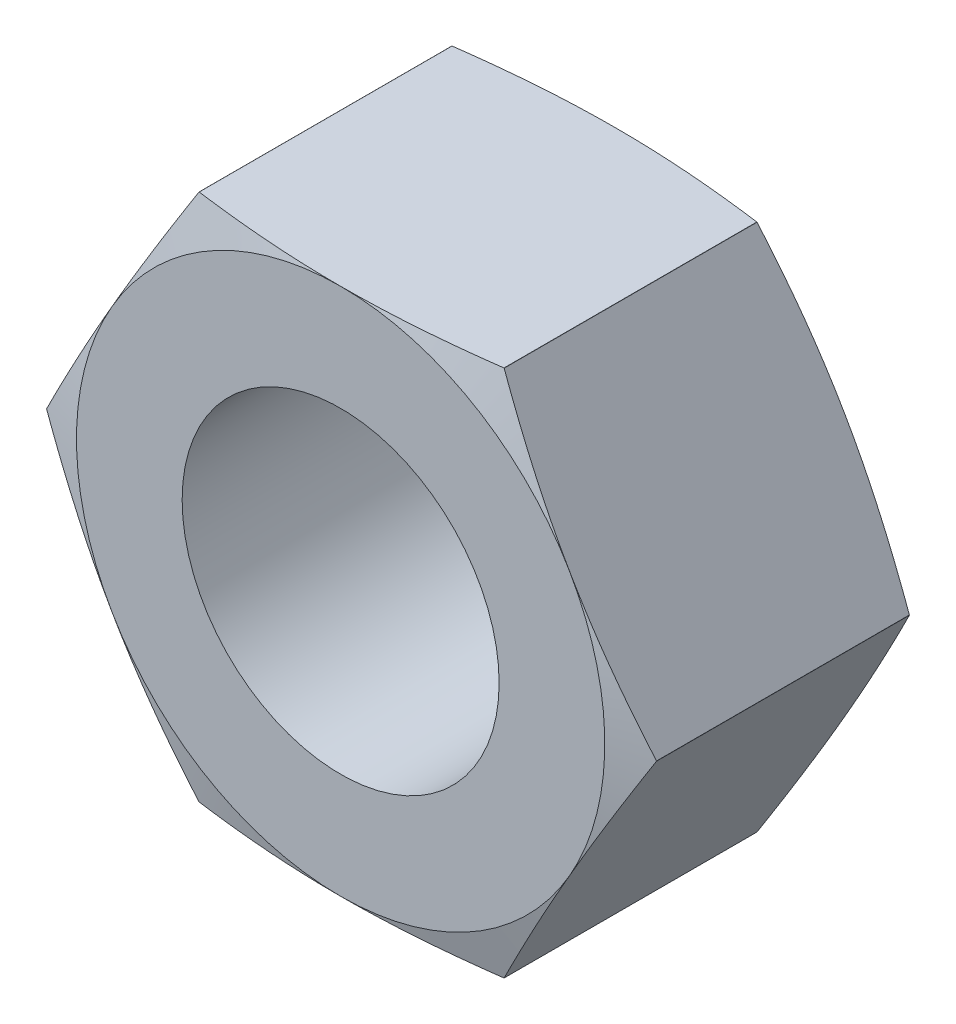
ISO-10303-21;
HEADER;
FILE_DESCRIPTION(('STEP AP214'),'2;1');
FILE_NAME('part.step','',(''),(''),'','','');
FILE_SCHEMA(('AUTOMOTIVE_DESIGN { 1 0 10303 214 1 1 1 1 }'));
ENDSEC;
DATA;
#1=APPLICATION_CONTEXT('core data for automotive mechanical design processes');
#2=APPLICATION_PROTOCOL_DEFINITION('international standard','automotive_design',2000,#1);
#3=PRODUCT_CONTEXT('',#1,'mechanical');
#4=PRODUCT('Part','Part','',(#3));
#5=PRODUCT_RELATED_PRODUCT_CATEGORY('part','',(#4));
#6=PRODUCT_DEFINITION_FORMATION('','',#4);
#7=PRODUCT_DEFINITION_CONTEXT('part definition',#1,'design');
#8=PRODUCT_DEFINITION('design','',#6,#7);
#9=PRODUCT_DEFINITION_SHAPE('','',#8);
#10=(LENGTH_UNIT() NAMED_UNIT(*) SI_UNIT(.MILLI.,.METRE.));
#11=(NAMED_UNIT(*) PLANE_ANGLE_UNIT() SI_UNIT($,.RADIAN.));
#12=(NAMED_UNIT(*) SI_UNIT($,.STERADIAN.) SOLID_ANGLE_UNIT());
#13=UNCERTAINTY_MEASURE_WITH_UNIT(LENGTH_MEASURE(1.E-05),#10,'distance_accuracy_value','');
#14=(GEOMETRIC_REPRESENTATION_CONTEXT(3) GLOBAL_UNCERTAINTY_ASSIGNED_CONTEXT((#13)) GLOBAL_UNIT_ASSIGNED_CONTEXT((#10,
#11,#12)) REPRESENTATION_CONTEXT('',''));
#15=CARTESIAN_POINT('',(0.,0.,0.));
#16=DIRECTION('',(0.,0.,1.));
#17=DIRECTION('',(1.,0.,0.));
#18=AXIS2_PLACEMENT_3D('',#15,#16,#17);
#19=CARTESIAN_POINT('',(0.,0.,-266.4));
#20=DIRECTION('',(0.,0.,-1.));
#21=DIRECTION('',(1.,0.,0.));
#22=AXIS2_PLACEMENT_3D('',#19,#20,#21);
#23=CONICAL_SURFACE('',#22,5.,1.3086733436);
#24=CARTESIAN_POINT('',(5.77250243201678,0.00173250093295696,-266.607259421658));
#25=CARTESIAN_POINT('',(4.99959793859298,1.3404423529406,-266.400000005441));
#26=CARTESIAN_POINT('',(4.33012705684315,2.49999993431865,-266.399999999992));
#27=(BOUNDED_CURVE() B_SPLINE_CURVE(2,(#24,#25,#26),.UNSPECIFIED.,.F.,
.F.) B_SPLINE_CURVE_WITH_KNOTS((3,3),(0.,1.),
.UNSPECIFIED.) CURVE() GEOMETRIC_REPRESENTATION_ITEM() RATIONAL_B_SPLINE_CURVE((1.,
1.03790667442982,1.)) REPRESENTATION_ITEM(''));
#28=CARTESIAN_POINT('',(5.772502431908,0.001732501119538,-266.6072594216));
#29=VERTEX_POINT('',#28);
#30=CARTESIAN_POINT('',(4.330127056858,2.499999934293,-266.4));
#31=VERTEX_POINT('',#30);
#32=EDGE_CURVE('E329',#29,#31,#27,.T.);
#33=ORIENTED_EDGE('',*,*,#32,.T.);
#34=CARTESIAN_POINT('',(0.,0.,-266.4));
#35=DIRECTION('',(0.,0.,-1.));
#36=DIRECTION('',(0.866025411371549,0.49999998685874,0.));
#37=AXIS2_PLACEMENT_3D('',#34,#35,#36);
#38=CIRCLE('',#37,5.);
#39=CARTESIAN_POINT('',(4.330127006451,-2.500000021602,-266.4));
#40=VERTEX_POINT('',#39);
#41=EDGE_CURVE('E532',#31,#40,#38,.T.);
#42=ORIENTED_EDGE('',*,*,#41,.T.);
#43=CARTESIAN_POINT('',(4.33012700646513,-2.50000002157593,-266.399999999992));
#44=CARTESIAN_POINT('',(4.99959791153964,-1.34044239979835,-266.399999998202));
#45=CARTESIAN_POINT('',(5.77250243187274,-0.00173250118245028,-266.60725942162));
#46=(BOUNDED_CURVE() B_SPLINE_CURVE(2,(#43,#44,#45),.UNSPECIFIED.,.F.,
.F.) B_SPLINE_CURVE_WITH_KNOTS((3,3),(0.,1.),
.UNSPECIFIED.) CURVE() GEOMETRIC_REPRESENTATION_ITEM() RATIONAL_B_SPLINE_CURVE((1.,
1.03790667722426,1.)) REPRESENTATION_ITEM(''));
#47=CARTESIAN_POINT('',(5.772502431908,-0.001732501119656,-266.6072594216));
#48=VERTEX_POINT('',#47);
#49=EDGE_CURVE('E253',#40,#48,#46,.T.);
#50=ORIENTED_EDGE('',*,*,#49,.T.);
#51=CARTESIAN_POINT('',(0.,0.,-266.6072594216));
#52=DIRECTION('',(0.,0.,-1.));
#53=DIRECTION('',(0.999999954960996,0.000300129980368399,0.));
#54=AXIS2_PLACEMENT_3D('',#51,#52,#53);
#55=CIRCLE('',#54,5.772502691896);
#56=EDGE_CURVE('E305',#29,#48,#55,.T.);
#57=ORIENTED_EDGE('',*,*,#56,.F.);
#58=EDGE_LOOP('',(#33,#42,#50,#57));
#59=FACE_BOUND('',#58,.T.);
#60=ADVANCED_FACE('F16',(#59),#23,.T.);
#61=CARTESIAN_POINT('',(0.,0.,-266.4));
#62=DIRECTION('',(0.,0.,-1.));
#63=DIRECTION('',(1.,0.,0.));
#64=AXIS2_PLACEMENT_3D('',#61,#62,#63);
#65=CONICAL_SURFACE('',#64,5.,1.3086733436);
#66=CARTESIAN_POINT('',(-2.99468702875652E-08,-5.,-266.399999999992));
#67=CARTESIAN_POINT('',(1.33894178253821,-5.00000000000001,-266.399999997841));
#68=CARTESIAN_POINT('',(2.88475082590115,-5.,-266.60725942162));
#69=(BOUNDED_CURVE() B_SPLINE_CURVE(2,(#66,#67,#68),.UNSPECIFIED.,.F.,
.F.) B_SPLINE_CURVE_WITH_KNOTS((3,3),(0.,1.),
.UNSPECIFIED.) CURVE() GEOMETRIC_REPRESENTATION_ITEM() RATIONAL_B_SPLINE_CURVE((1.,
1.03790667736198,1.)) REPRESENTATION_ITEM(''));
#70=CARTESIAN_POINT('',(-2.997651106634E-08,-5.,-266.4));
#71=VERTEX_POINT('',#70);
#72=CARTESIAN_POINT('',(2.884750825973,-5.,-266.6072594216));
#73=VERTEX_POINT('',#72);
#74=EDGE_CURVE('E226',#71,#73,#69,.T.);
#75=ORIENTED_EDGE('',*,*,#74,.T.);
#76=CARTESIAN_POINT('',(0.,0.,-266.6072594216));
#77=DIRECTION('',(0.,0.,1.));
#78=DIRECTION('',(1.,0.,0.));
#79=AXIS2_PLACEMENT_3D('',#76,#77,#78);
#80=CIRCLE('',#79,5.772502691896);
#81=CARTESIAN_POINT('',(2.887751605936,-4.99826749888,-266.6072594216));
#82=VERTEX_POINT('',#81);
#83=EDGE_CURVE('E11',#73,#82,#80,.T.);
#84=ORIENTED_EDGE('',*,*,#83,.T.);
#85=CARTESIAN_POINT('',(2.88775160582762,-4.99826749906635,-266.607259421658));
#86=CARTESIAN_POINT('',(3.66065611289654,-3.65955762342468,-266.400000001782));
#87=CARTESIAN_POINT('',(4.33012700646513,-2.50000002157593,-266.399999999992));
#88=(BOUNDED_CURVE() B_SPLINE_CURVE(2,(#85,#86,#87),.UNSPECIFIED.,.F.,
.F.) B_SPLINE_CURVE_WITH_KNOTS((3,3),(0.,1.),
.UNSPECIFIED.) CURVE() GEOMETRIC_REPRESENTATION_ITEM() RATIONAL_B_SPLINE_CURVE((1.,
1.03790667584399,1.)) REPRESENTATION_ITEM(''));
#89=EDGE_CURVE('E278',#82,#40,#88,.T.);
#90=ORIENTED_EDGE('',*,*,#89,.T.);
#91=CARTESIAN_POINT('',(0.,0.,-266.4));
#92=DIRECTION('',(0.,0.,1.));
#93=DIRECTION('',(1.,0.,0.));
#94=AXIS2_PLACEMENT_3D('',#91,#92,#93);
#95=CIRCLE('',#94,5.);
#96=EDGE_CURVE('E499',#71,#40,#95,.T.);
#97=ORIENTED_EDGE('',*,*,#96,.F.);
#98=EDGE_LOOP('',(#75,#84,#90,#97));
#99=FACE_BOUND('',#98,.T.);
#100=ADVANCED_FACE('F585',(#99),#65,.T.);
#101=CARTESIAN_POINT('',(0.,0.,-266.4));
#102=DIRECTION('',(0.,0.,-1.));
#103=DIRECTION('',(1.,0.,0.));
#104=AXIS2_PLACEMENT_3D('',#101,#102,#103);
#105=CONICAL_SURFACE('',#104,5.,1.3086733436);
#106=CARTESIAN_POINT('',(-4.33012703758911,-2.49999996766763,-266.399999999992));
#107=CARTESIAN_POINT('',(-3.66065612963208,-3.65955759443787,-266.39999999731));
#108=CARTESIAN_POINT('',(-2.88775160597136,-4.99826749881738,-266.60725942162));
#109=(BOUNDED_CURVE() B_SPLINE_CURVE(2,(#106,#107,#108),.UNSPECIFIED.,.F.,
.F.) B_SPLINE_CURVE_WITH_KNOTS((3,3),(0.,1.),
.UNSPECIFIED.) CURVE() GEOMETRIC_REPRESENTATION_ITEM() RATIONAL_B_SPLINE_CURVE((1.,
1.03790667756841,1.)) REPRESENTATION_ITEM(''));
#110=CARTESIAN_POINT('',(-4.330127037604,-2.499999967642,-266.4));
#111=VERTEX_POINT('',#110);
#112=CARTESIAN_POINT('',(-2.887751605936,-4.99826749888,-266.6072594216));
#113=VERTEX_POINT('',#112);
#114=EDGE_CURVE('E474',#111,#113,#109,.T.);
#115=ORIENTED_EDGE('',*,*,#114,.T.);
#116=CARTESIAN_POINT('',(0.,0.,-266.6072594216));
#117=DIRECTION('',(0.,0.,1.));
#118=DIRECTION('',(1.,0.,0.));
#119=AXIS2_PLACEMENT_3D('',#116,#117,#118);
#120=CIRCLE('',#119,5.772502691896);
#121=CARTESIAN_POINT('',(-2.884750825973,-5.,-266.6072594216));
#122=VERTEX_POINT('',#121);
#123=EDGE_CURVE('E197',#113,#122,#120,.T.);
#124=ORIENTED_EDGE('',*,*,#123,.T.);
#125=CARTESIAN_POINT('',(-2.88475082618839,-5.,-266.607259421658));
#126=CARTESIAN_POINT('',(-1.33894181474786,-5.,-266.400000002144));
#127=CARTESIAN_POINT('',(-2.99468702875652E-08,-5.,-266.399999999992));
#128=(BOUNDED_CURVE() B_SPLINE_CURVE(2,(#125,#126,#127),.UNSPECIFIED.,.F.,
.F.) B_SPLINE_CURVE_WITH_KNOTS((3,3),(0.,1.),
.UNSPECIFIED.) CURVE() GEOMETRIC_REPRESENTATION_ITEM() RATIONAL_B_SPLINE_CURVE((1.,
1.03790667570482,1.)) REPRESENTATION_ITEM(''));
#129=EDGE_CURVE('E230',#122,#71,#128,.T.);
#130=ORIENTED_EDGE('',*,*,#129,.T.);
#131=CARTESIAN_POINT('',(0.,0.,-266.4));
#132=DIRECTION('',(0.,0.,1.));
#133=DIRECTION('',(1.,0.,0.));
#134=AXIS2_PLACEMENT_3D('',#131,#132,#133);
#135=CIRCLE('',#134,5.);
#136=EDGE_CURVE('E495',#111,#71,#135,.T.);
#137=ORIENTED_EDGE('',*,*,#136,.F.);
#138=EDGE_LOOP('',(#115,#124,#130,#137));
#139=FACE_BOUND('',#138,.T.);
#140=ADVANCED_FACE('F18',(#139),#105,.T.);
#141=CARTESIAN_POINT('',(0.,0.,-266.4));
#142=DIRECTION('',(0.,0.,-1.));
#143=DIRECTION('',(1.,0.,0.));
#144=AXIS2_PLACEMENT_3D('',#141,#142,#143);
#145=CONICAL_SURFACE('',#144,5.,1.3086733436);
#146=CARTESIAN_POINT('',(0.,0.,-266.6072594216));
#147=DIRECTION('',(0.,0.,1.));
#148=DIRECTION('',(1.,0.,0.));
#149=AXIS2_PLACEMENT_3D('',#146,#147,#148);
#150=CIRCLE('',#149,5.772502691896);
#151=CARTESIAN_POINT('',(-5.772502431908,0.001732501119541,-266.6072594216));
#152=VERTEX_POINT('',#151);
#153=CARTESIAN_POINT('',(-5.772502431908,-0.001732501119651,-266.6072594216));
#154=VERTEX_POINT('',#153);
#155=EDGE_CURVE('E471',#152,#154,#150,.T.);
#156=ORIENTED_EDGE('',*,*,#155,.T.);
#157=CARTESIAN_POINT('',(-5.77250243201669,-0.00173250093311283,-266.607259421658));
#158=CARTESIAN_POINT('',(-4.99959792827548,-1.34044237081102,-266.400000002674));
#159=CARTESIAN_POINT('',(-4.33012703758911,-2.49999996766763,-266.399999999992));
#160=(BOUNDED_CURVE() B_SPLINE_CURVE(2,(#157,#158,#159),.UNSPECIFIED.,.F.,
.F.) B_SPLINE_CURVE_WITH_KNOTS((3,3),(0.,1.),
.UNSPECIFIED.) CURVE() GEOMETRIC_REPRESENTATION_ITEM() RATIONAL_B_SPLINE_CURVE((1.,
1.03790667549916,1.)) REPRESENTATION_ITEM(''));
#161=EDGE_CURVE('E212',#154,#111,#160,.T.);
#162=ORIENTED_EDGE('',*,*,#161,.T.);
#163=CARTESIAN_POINT('',(0.,0.,-266.4));
#164=DIRECTION('',(0.,0.,1.));
#165=DIRECTION('',(1.,0.,0.));
#166=AXIS2_PLACEMENT_3D('',#163,#164,#165);
#167=CIRCLE('',#166,5.);
#168=CARTESIAN_POINT('',(-4.330127037604,2.499999967642,-266.4));
#169=VERTEX_POINT('',#168);
#170=EDGE_CURVE('E490',#169,#111,#167,.T.);
#171=ORIENTED_EDGE('',*,*,#170,.F.);
#172=CARTESIAN_POINT('',(-4.33012703761875,2.49999996761629,-266.399999999992));
#173=CARTESIAN_POINT('',(-4.99959792823352,1.34044237088372,-266.400000002679));
#174=CARTESIAN_POINT('',(-5.77250243187277,0.00173250118238588,-266.60725942162));
#175=(BOUNDED_CURVE() B_SPLINE_CURVE(2,(#172,#173,#174),.UNSPECIFIED.,.F.,
.F.) B_SPLINE_CURVE_WITH_KNOTS((3,3),(0.,1.),
.UNSPECIFIED.) CURVE() GEOMETRIC_REPRESENTATION_ITEM() RATIONAL_B_SPLINE_CURVE((1.,
1.03790667549146,1.)) REPRESENTATION_ITEM(''));
#176=EDGE_CURVE('E419',#169,#152,#175,.T.);
#177=ORIENTED_EDGE('',*,*,#176,.T.);
#178=EDGE_LOOP('',(#156,#162,#171,#177));
#179=FACE_BOUND('',#178,.T.);
#180=ADVANCED_FACE('F488',(#179),#145,.T.);
#181=CARTESIAN_POINT('',(0.,0.,-266.4));
#182=DIRECTION('',(0.,0.,-1.));
#183=DIRECTION('',(1.,0.,0.));
#184=AXIS2_PLACEMENT_3D('',#181,#182,#183);
#185=CONICAL_SURFACE('',#184,5.,1.3086733436);
#186=CARTESIAN_POINT('',(0.,0.,-266.6072594216));
#187=DIRECTION('',(0.,0.,1.));
#188=DIRECTION('',(1.,0.,0.));
#189=AXIS2_PLACEMENT_3D('',#186,#187,#188);
#190=CIRCLE('',#189,5.772502691896);
#191=CARTESIAN_POINT('',(-2.884750825973,5.,-266.6072594216));
#192=VERTEX_POINT('',#191);
#193=CARTESIAN_POINT('',(-2.887751605936,4.99826749888,-266.6072594216));
#194=VERTEX_POINT('',#193);
#195=EDGE_CURVE('E415',#192,#194,#190,.T.);
#196=ORIENTED_EDGE('',*,*,#195,.T.);
#197=CARTESIAN_POINT('',(-2.88775160582761,4.99826749906636,-266.607259421658));
#198=CARTESIAN_POINT('',(-3.66065612959035,3.65955759451015,-266.399999997306));
#199=CARTESIAN_POINT('',(-4.33012703761875,2.49999996761629,-266.399999999992));
#200=(BOUNDED_CURVE() B_SPLINE_CURVE(2,(#197,#198,#199),.UNSPECIFIED.,.F.,
.F.) B_SPLINE_CURVE_WITH_KNOTS((3,3),(0.,1.),
.UNSPECIFIED.) CURVE() GEOMETRIC_REPRESENTATION_ITEM() RATIONAL_B_SPLINE_CURVE((1.,
1.03790667757665,1.)) REPRESENTATION_ITEM(''));
#201=EDGE_CURVE('E428',#194,#169,#200,.T.);
#202=ORIENTED_EDGE('',*,*,#201,.T.);
#203=CARTESIAN_POINT('',(0.,0.,-266.4));
#204=DIRECTION('',(0.,0.,1.));
#205=DIRECTION('',(1.,0.,0.));
#206=AXIS2_PLACEMENT_3D('',#203,#204,#205);
#207=CIRCLE('',#206,5.);
#208=CARTESIAN_POINT('',(2.997671926006E-08,5.,-266.4));
#209=VERTEX_POINT('',#208);
#210=EDGE_CURVE('E504',#209,#169,#207,.T.);
#211=ORIENTED_EDGE('',*,*,#210,.F.);
#212=CARTESIAN_POINT('',(2.99470784543835E-08,5.,-266.399999999992));
#213=CARTESIAN_POINT('',(-1.3389417825381,5.,-266.39999999784));
#214=CARTESIAN_POINT('',(-2.88475082590115,5.,-266.60725942162));
#215=(BOUNDED_CURVE() B_SPLINE_CURVE(2,(#212,#213,#214),.UNSPECIFIED.,.F.,
.F.) B_SPLINE_CURVE_WITH_KNOTS((3,3),(0.,1.),
.UNSPECIFIED.) CURVE() GEOMETRIC_REPRESENTATION_ITEM() RATIONAL_B_SPLINE_CURVE((1.,
1.03790667736198,1.)) REPRESENTATION_ITEM(''));
#216=EDGE_CURVE('E381',#209,#192,#215,.T.);
#217=ORIENTED_EDGE('',*,*,#216,.T.);
#218=EDGE_LOOP('',(#196,#202,#211,#217));
#219=FACE_BOUND('',#218,.T.);
#220=ADVANCED_FACE('F599',(#219),#185,.T.);
#221=CARTESIAN_POINT('',(0.,0.,-266.4));
#222=DIRECTION('',(0.,0.,-1.));
#223=DIRECTION('',(1.,0.,0.));
#224=AXIS2_PLACEMENT_3D('',#221,#222,#223);
#225=CONICAL_SURFACE('',#224,5.,1.3086733436);
#226=CARTESIAN_POINT('',(0.,0.,-266.6072594216));
#227=DIRECTION('',(0.,0.,1.));
#228=DIRECTION('',(1.,0.,0.));
#229=AXIS2_PLACEMENT_3D('',#226,#227,#228);
#230=CIRCLE('',#229,5.772502691896);
#231=CARTESIAN_POINT('',(2.887751605936,4.99826749888,-266.6072594216));
#232=VERTEX_POINT('',#231);
#233=CARTESIAN_POINT('',(2.884750825973,5.,-266.6072594216));
#234=VERTEX_POINT('',#233);
#235=EDGE_CURVE('E319',#232,#234,#230,.T.);
#236=ORIENTED_EDGE('',*,*,#235,.T.);
#237=CARTESIAN_POINT('',(2.88475082618839,5.,-266.607259421658));
#238=CARTESIAN_POINT('',(1.33894181474798,5.,-266.400000002144));
#239=CARTESIAN_POINT('',(2.99470784543835E-08,5.,-266.399999999992));
#240=(BOUNDED_CURVE() B_SPLINE_CURVE(2,(#237,#238,#239),.UNSPECIFIED.,.F.,
.F.) B_SPLINE_CURVE_WITH_KNOTS((3,3),(0.,1.),
.UNSPECIFIED.) CURVE() GEOMETRIC_REPRESENTATION_ITEM() RATIONAL_B_SPLINE_CURVE((1.,
1.03790667570482,1.)) REPRESENTATION_ITEM(''));
#241=EDGE_CURVE('E393',#234,#209,#240,.T.);
#242=ORIENTED_EDGE('',*,*,#241,.T.);
#243=CARTESIAN_POINT('',(0.,0.,-266.4));
#244=DIRECTION('',(0.,0.,1.));
#245=DIRECTION('',(1.,0.,0.));
#246=AXIS2_PLACEMENT_3D('',#243,#244,#245);
#247=CIRCLE('',#246,5.);
#248=EDGE_CURVE('E510',#31,#209,#247,.T.);
#249=ORIENTED_EDGE('',*,*,#248,.F.);
#250=CARTESIAN_POINT('',(4.33012705684315,2.49999993431865,-266.399999999992));
#251=CARTESIAN_POINT('',(3.66065613994946,3.65955757656765,-266.399999994543));
#252=CARTESIAN_POINT('',(2.88775160597136,4.99826749881738,-266.60725942162));
#253=(BOUNDED_CURVE() B_SPLINE_CURVE(2,(#250,#251,#252),.UNSPECIFIED.,.F.,
.F.) B_SPLINE_CURVE_WITH_KNOTS((3,3),(0.,1.),
.UNSPECIFIED.) CURVE() GEOMETRIC_REPRESENTATION_ITEM() RATIONAL_B_SPLINE_CURVE((1.,
1.03790667863747,1.)) REPRESENTATION_ITEM(''));
#254=EDGE_CURVE('E323',#31,#232,#253,.T.);
#255=ORIENTED_EDGE('',*,*,#254,.T.);
#256=EDGE_LOOP('',(#236,#242,#249,#255));
#257=FACE_BOUND('',#256,.T.);
#258=ADVANCED_FACE('F590',(#257),#225,.T.);
#259=CARTESIAN_POINT('',(0.,0.,-271.3927405783));
#260=DIRECTION('',(0.,0.,1.));
#261=DIRECTION('',(1.,0.,0.));
#262=AXIS2_PLACEMENT_3D('',#259,#260,#261);
#263=CONICAL_SURFACE('',#262,5.772502691896,1.3086733436);
#264=CARTESIAN_POINT('',(4.33012705668645,2.49999993459006,-271.599999999908));
#265=CARTESIAN_POINT('',(4.99959793845105,1.34044235318643,-271.599999994482));
#266=CARTESIAN_POINT('',(5.77250243187277,0.00173250118238943,-271.39274057828));
#267=(BOUNDED_CURVE() B_SPLINE_CURVE(2,(#264,#265,#266),.UNSPECIFIED.,.F.,
.F.) B_SPLINE_CURVE_WITH_KNOTS((3,3),(0.,1.),
.UNSPECIFIED.) CURVE() GEOMETRIC_REPRESENTATION_ITEM() RATIONAL_B_SPLINE_CURVE((1.,
1.03790667443167,1.)) REPRESENTATION_ITEM(''));
#268=CARTESIAN_POINT('',(4.330127056858,2.499999934293,-271.6));
#269=VERTEX_POINT('',#268);
#270=CARTESIAN_POINT('',(5.772502431908,0.001732501119536,-271.3927405783));
#271=VERTEX_POINT('',#270);
#272=EDGE_CURVE('E346',#269,#271,#267,.T.);
#273=ORIENTED_EDGE('',*,*,#272,.T.);
#274=CARTESIAN_POINT('',(0.,0.,-271.3927405783));
#275=DIRECTION('',(0.,0.,-1.));
#276=DIRECTION('',(0.999999954960996,0.000300129980368399,0.));
#277=AXIS2_PLACEMENT_3D('',#274,#275,#276);
#278=CIRCLE('',#277,5.772502691896);
#279=CARTESIAN_POINT('',(5.772502431908,-0.001732501119658,-271.3927405783));
#280=VERTEX_POINT('',#279);
#281=EDGE_CURVE('E314',#271,#280,#278,.T.);
#282=ORIENTED_EDGE('',*,*,#281,.T.);
#283=CARTESIAN_POINT('',(5.77250243201668,-0.00173250093313771,-271.392740578242));
#284=CARTESIAN_POINT('',(4.99959791168147,-1.34044239955269,-271.600000001676));
#285=CARTESIAN_POINT('',(4.33012700662182,-2.50000002130453,-271.599999999908));
#286=(BOUNDED_CURVE() B_SPLINE_CURVE(2,(#283,#284,#285),.UNSPECIFIED.,.F.,
.F.) B_SPLINE_CURVE_WITH_KNOTS((3,3),(0.,1.),
.UNSPECIFIED.) CURVE() GEOMETRIC_REPRESENTATION_ITEM() RATIONAL_B_SPLINE_CURVE((1.,
1.03790667722016,1.)) REPRESENTATION_ITEM(''));
#287=CARTESIAN_POINT('',(4.330127006451,-2.500000021602,-271.6));
#288=VERTEX_POINT('',#287);
#289=EDGE_CURVE('E289',#280,#288,#286,.T.);
#290=ORIENTED_EDGE('',*,*,#289,.T.);
#291=CARTESIAN_POINT('',(0.,0.,-271.6));
#292=DIRECTION('',(0.,0.,1.));
#293=DIRECTION('',(0.866025401290214,-0.500000004320124,0.));
#294=AXIS2_PLACEMENT_3D('',#291,#292,#293);
#295=CIRCLE('',#294,5.);
#296=EDGE_CURVE('E257',#288,#269,#295,.T.);
#297=ORIENTED_EDGE('',*,*,#296,.T.);
#298=EDGE_LOOP('',(#273,#282,#290,#297));
#299=FACE_BOUND('',#298,.T.);
#300=ADVANCED_FACE('F574',(#299),#263,.T.);
#301=CARTESIAN_POINT('',(0.,0.,-271.3927405783));
#302=DIRECTION('',(0.,0.,1.));
#303=DIRECTION('',(1.,0.,0.));
#304=AXIS2_PLACEMENT_3D('',#301,#302,#303);
#305=CONICAL_SURFACE('',#304,5.772502691896,1.3086733436);
#306=CARTESIAN_POINT('',(0.,0.,-271.6));
#307=DIRECTION('',(0.,0.,1.));
#308=DIRECTION('',(1.,0.,0.));
#309=AXIS2_PLACEMENT_3D('',#306,#307,#308);
#310=CIRCLE('',#309,5.);
#311=CARTESIAN_POINT('',(2.997671926006E-08,5.,-271.6));
#312=VERTEX_POINT('',#311);
#313=EDGE_CURVE('E264',#269,#312,#310,.T.);
#314=ORIENTED_EDGE('',*,*,#313,.T.);
#315=CARTESIAN_POINT('',(2.96336839663826E-08,5.,-271.599999999908));
#316=CARTESIAN_POINT('',(1.33894181446477,5.,-271.599999997779));
#317=CARTESIAN_POINT('',(2.88475082590115,5.,-271.39274057828));
#318=(BOUNDED_CURVE() B_SPLINE_CURVE(2,(#315,#316,#317),.UNSPECIFIED.,.F.,
.F.) B_SPLINE_CURVE_WITH_KNOTS((3,3),(0.,1.),
.UNSPECIFIED.) CURVE() GEOMETRIC_REPRESENTATION_ITEM() RATIONAL_B_SPLINE_CURVE((1.,
1.03790667570673,1.)) REPRESENTATION_ITEM(''));
#319=CARTESIAN_POINT('',(2.884750825973,5.,-271.3927405783));
#320=VERTEX_POINT('',#319);
#321=EDGE_CURVE('E337',#312,#320,#318,.T.);
#322=ORIENTED_EDGE('',*,*,#321,.T.);
#323=CARTESIAN_POINT('',(0.,0.,-271.3927405783));
#324=DIRECTION('',(0.,0.,1.));
#325=DIRECTION('',(1.,0.,0.));
#326=AXIS2_PLACEMENT_3D('',#323,#324,#325);
#327=CIRCLE('',#326,5.772502691896);
#328=CARTESIAN_POINT('',(2.887751605936,4.99826749888,-271.3927405783));
#329=VERTEX_POINT('',#328);
#330=EDGE_CURVE('E320',#329,#320,#327,.T.);
#331=ORIENTED_EDGE('',*,*,#330,.F.);
#332=CARTESIAN_POINT('',(2.88775160582762,4.99826749906635,-271.392740578242));
#333=CARTESIAN_POINT('',(3.6606561398079,3.65955757681283,-271.600000005334));
#334=CARTESIAN_POINT('',(4.33012705668645,2.49999993459006,-271.599999999908));
#335=(BOUNDED_CURVE() B_SPLINE_CURVE(2,(#332,#333,#334),.UNSPECIFIED.,.F.,
.F.) B_SPLINE_CURVE_WITH_KNOTS((3,3),(0.,1.),
.UNSPECIFIED.) CURVE() GEOMETRIC_REPRESENTATION_ITEM() RATIONAL_B_SPLINE_CURVE((1.,
1.03790667863646,1.)) REPRESENTATION_ITEM(''));
#336=EDGE_CURVE('E353',#329,#269,#335,.T.);
#337=ORIENTED_EDGE('',*,*,#336,.T.);
#338=EDGE_LOOP('',(#314,#322,#331,#337));
#339=FACE_BOUND('',#338,.T.);
#340=ADVANCED_FACE('F608',(#339),#305,.T.);
#341=CARTESIAN_POINT('',(0.,0.,-271.3927405783));
#342=DIRECTION('',(0.,0.,1.));
#343=DIRECTION('',(1.,0.,0.));
#344=AXIS2_PLACEMENT_3D('',#341,#342,#343);
#345=CONICAL_SURFACE('',#344,5.772502691896,1.3086733436);
#346=CARTESIAN_POINT('',(-4.33012703777545,2.49999996734488,-271.599999999908));
#347=CARTESIAN_POINT('',(-3.66065612973193,3.65955759426492,-271.600000002617));
#348=CARTESIAN_POINT('',(-2.88775160597136,4.99826749881738,-271.39274057828));
#349=(BOUNDED_CURVE() B_SPLINE_CURVE(2,(#346,#347,#348),.UNSPECIFIED.,.F.,
.F.) B_SPLINE_CURVE_WITH_KNOTS((3,3),(0.,1.),
.UNSPECIFIED.) CURVE() GEOMETRIC_REPRESENTATION_ITEM() RATIONAL_B_SPLINE_CURVE((1.,
1.03790667757772,1.)) REPRESENTATION_ITEM(''));
#350=CARTESIAN_POINT('',(-4.330127037604,2.499999967642,-271.6));
#351=VERTEX_POINT('',#350);
#352=CARTESIAN_POINT('',(-2.887751605936,4.99826749888,-271.3927405783));
#353=VERTEX_POINT('',#352);
#354=EDGE_CURVE('E436',#351,#353,#349,.T.);
#355=ORIENTED_EDGE('',*,*,#354,.T.);
#356=CARTESIAN_POINT('',(0.,0.,-271.3927405783));
#357=DIRECTION('',(0.,0.,1.));
#358=DIRECTION('',(1.,0.,0.));
#359=AXIS2_PLACEMENT_3D('',#356,#357,#358);
#360=CIRCLE('',#359,5.772502691896);
#361=CARTESIAN_POINT('',(-2.884750825973,5.,-271.3927405783));
#362=VERTEX_POINT('',#361);
#363=EDGE_CURVE('E310',#362,#353,#360,.T.);
#364=ORIENTED_EDGE('',*,*,#363,.F.);
#365=CARTESIAN_POINT('',(-2.88475082618839,5.,-271.392740578242));
#366=CARTESIAN_POINT('',(-1.33894178282131,5.,-271.600000002037));
#367=CARTESIAN_POINT('',(2.96336839663826E-08,5.,-271.599999999908));
#368=(BOUNDED_CURVE() B_SPLINE_CURVE(2,(#365,#366,#367),.UNSPECIFIED.,.F.,
.F.) B_SPLINE_CURVE_WITH_KNOTS((3,3),(0.,1.),
.UNSPECIFIED.) CURVE() GEOMETRIC_REPRESENTATION_ITEM() RATIONAL_B_SPLINE_CURVE((1.,
1.03790667736251,1.)) REPRESENTATION_ITEM(''));
#369=EDGE_CURVE('E311',#362,#312,#368,.T.);
#370=ORIENTED_EDGE('',*,*,#369,.T.);
#371=CARTESIAN_POINT('',(0.,0.,-271.6));
#372=DIRECTION('',(0.,0.,1.));
#373=DIRECTION('',(1.,0.,0.));
#374=AXIS2_PLACEMENT_3D('',#371,#372,#373);
#375=CIRCLE('',#374,5.);
#376=EDGE_CURVE('E529',#312,#351,#375,.T.);
#377=ORIENTED_EDGE('',*,*,#376,.T.);
#378=EDGE_LOOP('',(#355,#364,#370,#377));
#379=FACE_BOUND('',#378,.T.);
#380=ADVANCED_FACE('F605',(#379),#345,.T.);
#381=CARTESIAN_POINT('',(0.,0.,-271.3927405783));
#382=DIRECTION('',(0.,0.,1.));
#383=DIRECTION('',(1.,0.,0.));
#384=AXIS2_PLACEMENT_3D('',#381,#382,#383);
#385=CONICAL_SURFACE('',#384,5.772502691896,1.3086733436);
#386=CARTESIAN_POINT('',(-4.33012703743241,-2.49999996793904,-271.599999999908));
#387=CARTESIAN_POINT('',(-4.99959792813362,-1.34044237105674,-271.599999997248));
#388=CARTESIAN_POINT('',(-5.77250243187274,-0.00173250118244184,-271.39274057828));
#389=(BOUNDED_CURVE() B_SPLINE_CURVE(2,(#386,#387,#388),.UNSPECIFIED.,.F.,
.F.) B_SPLINE_CURVE_WITH_KNOTS((3,3),(0.,1.),
.UNSPECIFIED.) CURVE() GEOMETRIC_REPRESENTATION_ITEM() RATIONAL_B_SPLINE_CURVE((1.,
1.03790667550088,1.)) REPRESENTATION_ITEM(''));
#390=CARTESIAN_POINT('',(-4.330127037604,-2.499999967642,-271.6));
#391=VERTEX_POINT('',#390);
#392=CARTESIAN_POINT('',(-5.772502431908,-0.001732501119653,-271.3927405783));
#393=VERTEX_POINT('',#392);
#394=EDGE_CURVE('E205',#391,#393,#389,.T.);
#395=ORIENTED_EDGE('',*,*,#394,.T.);
#396=CARTESIAN_POINT('',(0.,0.,-271.3927405783));
#397=DIRECTION('',(0.,0.,1.));
#398=DIRECTION('',(1.,0.,0.));
#399=AXIS2_PLACEMENT_3D('',#396,#397,#398);
#400=CIRCLE('',#399,5.772502691896);
#401=CARTESIAN_POINT('',(-5.772502431908,0.001732501119539,-271.3927405783));
#402=VERTEX_POINT('',#401);
#403=EDGE_CURVE('E466',#402,#393,#400,.T.);
#404=ORIENTED_EDGE('',*,*,#403,.F.);
#405=CARTESIAN_POINT('',(-5.77250243201679,0.00173250093294452,-271.392740578242));
#406=CARTESIAN_POINT('',(-4.99959792837547,1.34044237063784,-271.599999997199));
#407=CARTESIAN_POINT('',(-4.33012703777545,2.49999996734488,-271.599999999908));
#408=(BOUNDED_CURVE() B_SPLINE_CURVE(2,(#405,#406,#407),.UNSPECIFIED.,.F.,
.F.) B_SPLINE_CURVE_WITH_KNOTS((3,3),(0.,1.),
.UNSPECIFIED.) CURVE() GEOMETRIC_REPRESENTATION_ITEM() RATIONAL_B_SPLINE_CURVE((1.,
1.03790667548709,1.)) REPRESENTATION_ITEM(''));
#409=EDGE_CURVE('E444',#402,#351,#408,.T.);
#410=ORIENTED_EDGE('',*,*,#409,.T.);
#411=CARTESIAN_POINT('',(0.,0.,-271.6));
#412=DIRECTION('',(0.,0.,1.));
#413=DIRECTION('',(1.,0.,0.));
#414=AXIS2_PLACEMENT_3D('',#411,#412,#413);
#415=CIRCLE('',#414,5.);
#416=EDGE_CURVE('E524',#351,#391,#415,.T.);
#417=ORIENTED_EDGE('',*,*,#416,.T.);
#418=EDGE_LOOP('',(#395,#404,#410,#417));
#419=FACE_BOUND('',#418,.T.);
#420=ADVANCED_FACE('F563',(#419),#385,.T.);
#421=CARTESIAN_POINT('',(0.,0.,-271.3927405783));
#422=DIRECTION('',(0.,0.,1.));
#423=DIRECTION('',(1.,0.,0.));
#424=AXIS2_PLACEMENT_3D('',#421,#422,#423);
#425=CONICAL_SURFACE('',#424,5.772502691896,1.3086733436);
#426=CARTESIAN_POINT('',(0.,0.,-271.3927405783));
#427=DIRECTION('',(0.,0.,1.));
#428=DIRECTION('',(1.,0.,0.));
#429=AXIS2_PLACEMENT_3D('',#426,#427,#428);
#430=CIRCLE('',#429,5.772502691896);
#431=CARTESIAN_POINT('',(-2.887751605936,-4.99826749888,-271.3927405783));
#432=VERTEX_POINT('',#431);
#433=CARTESIAN_POINT('',(-2.884750825973,-5.,-271.3927405783));
#434=VERTEX_POINT('',#433);
#435=EDGE_CURVE('E179',#432,#434,#430,.T.);
#436=ORIENTED_EDGE('',*,*,#435,.F.);
#437=CARTESIAN_POINT('',(-2.88775160582761,-4.99826749906636,-271.392740578242));
#438=CARTESIAN_POINT('',(-3.6606561294905,-3.6595575946831,-271.600000002568));
#439=CARTESIAN_POINT('',(-4.33012703743241,-2.49999996793904,-271.599999999908));
#440=(BOUNDED_CURVE() B_SPLINE_CURVE(2,(#437,#438,#439),.UNSPECIFIED.,.F.,
.F.) B_SPLINE_CURVE_WITH_KNOTS((3,3),(0.,1.),
.UNSPECIFIED.) CURVE() GEOMETRIC_REPRESENTATION_ITEM() RATIONAL_B_SPLINE_CURVE((1.,
1.03790667756734,1.)) REPRESENTATION_ITEM(''));
#441=EDGE_CURVE('E184',#432,#391,#440,.T.);
#442=ORIENTED_EDGE('',*,*,#441,.T.);
#443=CARTESIAN_POINT('',(0.,0.,-271.6));
#444=DIRECTION('',(0.,0.,1.));
#445=DIRECTION('',(1.,0.,0.));
#446=AXIS2_PLACEMENT_3D('',#443,#444,#445);
#447=CIRCLE('',#446,5.);
#448=CARTESIAN_POINT('',(-2.997651106634E-08,-5.,-271.6));
#449=VERTEX_POINT('',#448);
#450=EDGE_CURVE('E522',#391,#449,#447,.T.);
#451=ORIENTED_EDGE('',*,*,#450,.T.);
#452=CARTESIAN_POINT('',(-2.96334752444552E-08,-5.,-271.599999999908));
#453=CARTESIAN_POINT('',(-1.33894181446465,-5.,-271.599999997779));
#454=CARTESIAN_POINT('',(-2.88475082590115,-5.,-271.39274057828));
#455=(BOUNDED_CURVE() B_SPLINE_CURVE(2,(#452,#453,#454),.UNSPECIFIED.,.F.,
.F.) B_SPLINE_CURVE_WITH_KNOTS((3,3),(0.,1.),
.UNSPECIFIED.) CURVE() GEOMETRIC_REPRESENTATION_ITEM() RATIONAL_B_SPLINE_CURVE((1.,
1.03790667570674,1.)) REPRESENTATION_ITEM(''));
#456=EDGE_CURVE('E186',#449,#434,#455,.T.);
#457=ORIENTED_EDGE('',*,*,#456,.T.);
#458=EDGE_LOOP('',(#436,#442,#451,#457));
#459=FACE_BOUND('',#458,.T.);
#460=ADVANCED_FACE('F181',(#459),#425,.T.);
#461=CARTESIAN_POINT('',(0.,0.,-266.6072594216));
#462=DIRECTION('',(0.,0.,-1.));
#463=DIRECTION('',(1.,0.,0.));
#464=AXIS2_PLACEMENT_3D('',#461,#462,#463);
#465=CYLINDRICAL_SURFACE('',#464,5.772502691896);
#466=DIRECTION('',(0.,0.,-1.));
#467=VECTOR('',#466,1.);
#468=CARTESIAN_POINT('',(2.884750825973,-5.,-266.6072594216));
#469=LINE('',#468,#467);
#470=CARTESIAN_POINT('',(2.884750825973,-5.,-271.3927405783));
#471=VERTEX_POINT('',#470);
#472=EDGE_CURVE('E26',#73,#471,#469,.T.);
#473=ORIENTED_EDGE('',*,*,#472,.T.);
#474=CARTESIAN_POINT('',(0.,0.,-271.3927405783));
#475=DIRECTION('',(0.,0.,1.));
#476=DIRECTION('',(1.,0.,0.));
#477=AXIS2_PLACEMENT_3D('',#474,#475,#476);
#478=CIRCLE('',#477,5.772502691896);
#479=CARTESIAN_POINT('',(2.887751605936,-4.99826749888,-271.3927405783));
#480=VERTEX_POINT('',#479);
#481=EDGE_CURVE('E239',#471,#480,#478,.T.);
#482=ORIENTED_EDGE('',*,*,#481,.T.);
#483=DIRECTION('',(0.,0.,-1.));
#484=VECTOR('',#483,1.);
#485=CARTESIAN_POINT('',(2.887751605936,-4.99826749888,-266.6072594216));
#486=LINE('',#485,#484);
#487=EDGE_CURVE('E283',#82,#480,#486,.T.);
#488=ORIENTED_EDGE('',*,*,#487,.F.);
#489=ORIENTED_EDGE('',*,*,#83,.F.);
#490=EDGE_LOOP('',(#473,#482,#488,#489));
#491=FACE_BOUND('',#490,.T.);
#492=ADVANCED_FACE('F238',(#491),#465,.T.);
#493=CARTESIAN_POINT('',(-2.886751345948,-5.,-266.4));
#494=DIRECTION('',(0.,1.,0.));
#495=DIRECTION('',(0.,0.,-1.));
#496=AXIS2_PLACEMENT_3D('',#493,#494,#495);
#497=PLANE('',#496);
#498=ORIENTED_EDGE('',*,*,#74,.F.);
#499=ORIENTED_EDGE('',*,*,#129,.F.);
#500=DIRECTION('',(0.,0.,-1.));
#501=VECTOR('',#500,1.);
#502=CARTESIAN_POINT('',(-2.884750825973,-5.,-266.6072594216));
#503=LINE('',#502,#501);
#504=EDGE_CURVE('E191',#122,#434,#503,.T.);
#505=ORIENTED_EDGE('',*,*,#504,.T.);
#506=ORIENTED_EDGE('',*,*,#456,.F.);
#507=CARTESIAN_POINT('',(2.88475082618839,-5.,-271.392740578242));
#508=CARTESIAN_POINT('',(1.33894178282143,-5.,-271.600000002037));
#509=CARTESIAN_POINT('',(-2.96334752444552E-08,-5.,-271.599999999908));
#510=(BOUNDED_CURVE() B_SPLINE_CURVE(2,(#507,#508,#509),.UNSPECIFIED.,.F.,
.F.) B_SPLINE_CURVE_WITH_KNOTS((3,3),(0.,1.),
.UNSPECIFIED.) CURVE() GEOMETRIC_REPRESENTATION_ITEM() RATIONAL_B_SPLINE_CURVE((1.,
1.03790667736005,1.)) REPRESENTATION_ITEM(''));
#511=EDGE_CURVE('E249',#471,#449,#510,.T.);
#512=ORIENTED_EDGE('',*,*,#511,.F.);
#513=ORIENTED_EDGE('',*,*,#472,.F.);
#514=EDGE_LOOP('',(#498,#499,#505,#506,#512,#513));
#515=FACE_BOUND('',#514,.T.);
#516=ADVANCED_FACE('F255',(#515),#497,.F.);
#517=CARTESIAN_POINT('',(0.,0.,-266.6072594216));
#518=DIRECTION('',(0.,0.,-1.));
#519=DIRECTION('',(1.,0.,0.));
#520=AXIS2_PLACEMENT_3D('',#517,#518,#519);
#521=CYLINDRICAL_SURFACE('',#520,5.772502691896);
#522=DIRECTION('',(0.,0.,-1.));
#523=VECTOR('',#522,1.);
#524=CARTESIAN_POINT('',(-2.887751605936,-4.99826749888,-266.6072594216));
#525=LINE('',#524,#523);
#526=EDGE_CURVE('E192',#113,#432,#525,.T.);
#527=ORIENTED_EDGE('',*,*,#526,.T.);
#528=ORIENTED_EDGE('',*,*,#435,.T.);
#529=ORIENTED_EDGE('',*,*,#504,.F.);
#530=ORIENTED_EDGE('',*,*,#123,.F.);
#531=EDGE_LOOP('',(#527,#528,#529,#530));
#532=FACE_BOUND('',#531,.T.);
#533=ADVANCED_FACE('F195',(#532),#521,.T.);
#534=CARTESIAN_POINT('',(-5.773502691896,0.,-266.4));
#535=DIRECTION('',(0.866025403784329,0.50000000000019,0.));
#536=DIRECTION('',(0.,0.,-1.));
#537=AXIS2_PLACEMENT_3D('',#534,#535,#536);
#538=PLANE('',#537);
#539=ORIENTED_EDGE('',*,*,#114,.F.);
#540=ORIENTED_EDGE('',*,*,#161,.F.);
#541=DIRECTION('',(0.,0.,-1.));
#542=VECTOR('',#541,1.);
#543=CARTESIAN_POINT('',(-5.772502431908,-0.001732501119652,-266.6072594216));
#544=LINE('',#543,#542);
#545=EDGE_CURVE('E470',#154,#393,#544,.T.);
#546=ORIENTED_EDGE('',*,*,#545,.T.);
#547=ORIENTED_EDGE('',*,*,#394,.F.);
#548=ORIENTED_EDGE('',*,*,#441,.F.);
#549=ORIENTED_EDGE('',*,*,#526,.F.);
#550=EDGE_LOOP('',(#539,#540,#546,#547,#548,#549));
#551=FACE_BOUND('',#550,.T.);
#552=ADVANCED_FACE('F203',(#551),#538,.F.);
#553=CARTESIAN_POINT('',(0.,0.,-266.6072594216));
#554=DIRECTION('',(0.,0.,-1.));
#555=DIRECTION('',(1.,0.,0.));
#556=AXIS2_PLACEMENT_3D('',#553,#554,#555);
#557=CYLINDRICAL_SURFACE('',#556,5.772502691896);
#558=ORIENTED_EDGE('',*,*,#403,.T.);
#559=ORIENTED_EDGE('',*,*,#545,.F.);
#560=ORIENTED_EDGE('',*,*,#155,.F.);
#561=DIRECTION('',(0.,0.,-1.));
#562=VECTOR('',#561,1.);
#563=CARTESIAN_POINT('',(-5.772502431908,0.00173250111954,-266.6072594216));
#564=LINE('',#563,#562);
#565=EDGE_CURVE('E459',#152,#402,#564,.T.);
#566=ORIENTED_EDGE('',*,*,#565,.T.);
#567=EDGE_LOOP('',(#558,#559,#560,#566));
#568=FACE_BOUND('',#567,.T.);
#569=ADVANCED_FACE('F559',(#568),#557,.T.);
#570=CARTESIAN_POINT('',(-2.886751345948,5.,-266.4));
#571=DIRECTION('',(0.866025403784329,-0.50000000000019,0.));
#572=DIRECTION('',(0.,0.,-1.));
#573=AXIS2_PLACEMENT_3D('',#570,#571,#572);
#574=PLANE('',#573);
#575=ORIENTED_EDGE('',*,*,#176,.F.);
#576=ORIENTED_EDGE('',*,*,#201,.F.);
#577=DIRECTION('',(0.,0.,-1.));
#578=VECTOR('',#577,1.);
#579=CARTESIAN_POINT('',(-2.887751605936,4.99826749888,-266.6072594216));
#580=LINE('',#579,#578);
#581=EDGE_CURVE('E414',#194,#353,#580,.T.);
#582=ORIENTED_EDGE('',*,*,#581,.T.);
#583=ORIENTED_EDGE('',*,*,#354,.F.);
#584=ORIENTED_EDGE('',*,*,#409,.F.);
#585=ORIENTED_EDGE('',*,*,#565,.F.);
#586=EDGE_LOOP('',(#575,#576,#582,#583,#584,#585));
#587=FACE_BOUND('',#586,.T.);
#588=ADVANCED_FACE('F603',(#587),#574,.F.);
#589=CARTESIAN_POINT('',(0.,0.,-266.6072594216));
#590=DIRECTION('',(0.,0.,-1.));
#591=DIRECTION('',(1.,0.,0.));
#592=AXIS2_PLACEMENT_3D('',#589,#590,#591);
#593=CYLINDRICAL_SURFACE('',#592,5.772502691896);
#594=ORIENTED_EDGE('',*,*,#363,.T.);
#595=ORIENTED_EDGE('',*,*,#581,.F.);
#596=ORIENTED_EDGE('',*,*,#195,.F.);
#597=DIRECTION('',(0.,0.,-1.));
#598=VECTOR('',#597,1.);
#599=CARTESIAN_POINT('',(-2.884750825973,5.,-266.6072594216));
#600=LINE('',#599,#598);
#601=EDGE_CURVE('E306',#192,#362,#600,.T.);
#602=ORIENTED_EDGE('',*,*,#601,.T.);
#603=EDGE_LOOP('',(#594,#595,#596,#602));
#604=FACE_BOUND('',#603,.T.);
#605=ADVANCED_FACE('F627',(#604),#593,.T.);
#606=CARTESIAN_POINT('',(2.886751345948,5.,-266.4));
#607=DIRECTION('',(0.,-1.,0.));
#608=DIRECTION('',(-1.,0.,0.));
#609=AXIS2_PLACEMENT_3D('',#606,#607,#608);
#610=PLANE('',#609);
#611=ORIENTED_EDGE('',*,*,#216,.F.);
#612=ORIENTED_EDGE('',*,*,#241,.F.);
#613=DIRECTION('',(0.,0.,-1.));
#614=VECTOR('',#613,1.);
#615=CARTESIAN_POINT('',(2.884750825973,5.,-266.6072594216));
#616=LINE('',#615,#614);
#617=EDGE_CURVE('E315',#234,#320,#616,.T.);
#618=ORIENTED_EDGE('',*,*,#617,.T.);
#619=ORIENTED_EDGE('',*,*,#321,.F.);
#620=ORIENTED_EDGE('',*,*,#369,.F.);
#621=ORIENTED_EDGE('',*,*,#601,.F.);
#622=EDGE_LOOP('',(#611,#612,#618,#619,#620,#621));
#623=FACE_BOUND('',#622,.T.);
#624=ADVANCED_FACE('F596',(#623),#610,.F.);
#625=CARTESIAN_POINT('',(0.,0.,-266.6072594216));
#626=DIRECTION('',(0.,0.,-1.));
#627=DIRECTION('',(1.,0.,0.));
#628=AXIS2_PLACEMENT_3D('',#625,#626,#627);
#629=CYLINDRICAL_SURFACE('',#628,5.772502691896);
#630=ORIENTED_EDGE('',*,*,#330,.T.);
#631=ORIENTED_EDGE('',*,*,#617,.F.);
#632=ORIENTED_EDGE('',*,*,#235,.F.);
#633=DIRECTION('',(0.,0.,-1.));
#634=VECTOR('',#633,1.);
#635=CARTESIAN_POINT('',(2.887751605936,4.99826749888,-266.6072594216));
#636=LINE('',#635,#634);
#637=EDGE_CURVE('E362',#232,#329,#636,.T.);
#638=ORIENTED_EDGE('',*,*,#637,.T.);
#639=EDGE_LOOP('',(#630,#631,#632,#638));
#640=FACE_BOUND('',#639,.T.);
#641=ADVANCED_FACE('F618',(#640),#629,.T.);
#642=CARTESIAN_POINT('',(5.773502691896,0.,-266.4));
#643=DIRECTION('',(-0.866025403784329,-0.50000000000019,0.));
#644=DIRECTION('',(-0.50000000000019,0.866025403784329,0.));
#645=AXIS2_PLACEMENT_3D('',#642,#643,#644);
#646=PLANE('',#645);
#647=ORIENTED_EDGE('',*,*,#254,.F.);
#648=ORIENTED_EDGE('',*,*,#32,.F.);
#649=DIRECTION('',(0.,0.,-1.));
#650=VECTOR('',#649,1.);
#651=CARTESIAN_POINT('',(5.772502431908,0.001732501119538,-266.6072594216));
#652=LINE('',#651,#650);
#653=EDGE_CURVE('E301',#29,#271,#652,.T.);
#654=ORIENTED_EDGE('',*,*,#653,.T.);
#655=ORIENTED_EDGE('',*,*,#272,.F.);
#656=ORIENTED_EDGE('',*,*,#336,.F.);
#657=ORIENTED_EDGE('',*,*,#637,.F.);
#658=EDGE_LOOP('',(#647,#648,#654,#655,#656,#657));
#659=FACE_BOUND('',#658,.T.);
#660=ADVANCED_FACE('F612',(#659),#646,.F.);
#661=CARTESIAN_POINT('',(0.,0.,-266.6072594216));
#662=DIRECTION('',(0.,0.,-1.));
#663=DIRECTION('',(1.,0.,0.));
#664=AXIS2_PLACEMENT_3D('',#661,#662,#663);
#665=CYLINDRICAL_SURFACE('',#664,5.772502691896);
#666=ORIENTED_EDGE('',*,*,#653,.F.);
#667=ORIENTED_EDGE('',*,*,#56,.T.);
#668=DIRECTION('',(0.,0.,-1.));
#669=VECTOR('',#668,1.);
#670=CARTESIAN_POINT('',(5.772502431908,-0.001732501119652,-266.6072594216));
#671=LINE('',#670,#669);
#672=EDGE_CURVE('E294',#48,#280,#671,.T.);
#673=ORIENTED_EDGE('',*,*,#672,.T.);
#674=ORIENTED_EDGE('',*,*,#281,.F.);
#675=EDGE_LOOP('',(#666,#667,#673,#674));
#676=FACE_BOUND('',#675,.T.);
#677=ADVANCED_FACE('F616',(#676),#665,.T.);
#678=CARTESIAN_POINT('',(2.886751345948,-5.,-266.4));
#679=DIRECTION('',(-0.866025403784329,0.50000000000019,0.));
#680=DIRECTION('',(0.,0.,1.));
#681=AXIS2_PLACEMENT_3D('',#678,#679,#680);
#682=PLANE('',#681);
#683=ORIENTED_EDGE('',*,*,#49,.F.);
#684=ORIENTED_EDGE('',*,*,#89,.F.);
#685=ORIENTED_EDGE('',*,*,#487,.T.);
#686=CARTESIAN_POINT('',(4.33012700662182,-2.50000002130453,-271.599999999908));
#687=CARTESIAN_POINT('',(3.6606561130381,-3.6595576231795,-271.599999998141));
#688=CARTESIAN_POINT('',(2.88775160597136,-4.99826749881738,-271.39274057828));
#689=(BOUNDED_CURVE() B_SPLINE_CURVE(2,(#686,#687,#688),.UNSPECIFIED.,.F.,
.F.) B_SPLINE_CURVE_WITH_KNOTS((3,3),(0.,1.),
.UNSPECIFIED.) CURVE() GEOMETRIC_REPRESENTATION_ITEM() RATIONAL_B_SPLINE_CURVE((1.,
1.03790667584501,1.)) REPRESENTATION_ITEM(''));
#690=EDGE_CURVE('E251',#288,#480,#689,.T.);
#691=ORIENTED_EDGE('',*,*,#690,.F.);
#692=ORIENTED_EDGE('',*,*,#289,.F.);
#693=ORIENTED_EDGE('',*,*,#672,.F.);
#694=EDGE_LOOP('',(#683,#684,#685,#691,#692,#693));
#695=FACE_BOUND('',#694,.T.);
#696=ADVANCED_FACE('F581',(#695),#682,.F.);
#697=CARTESIAN_POINT('',(0.,0.,-271.3927405783));
#698=DIRECTION('',(0.,0.,1.));
#699=DIRECTION('',(1.,0.,0.));
#700=AXIS2_PLACEMENT_3D('',#697,#698,#699);
#701=CONICAL_SURFACE('',#700,5.772502691896,1.3086733436);
#702=ORIENTED_EDGE('',*,*,#511,.T.);
#703=CARTESIAN_POINT('',(0.,0.,-271.6));
#704=DIRECTION('',(0.,0.,1.));
#705=DIRECTION('',(1.,0.,0.));
#706=AXIS2_PLACEMENT_3D('',#703,#704,#705);
#707=CIRCLE('',#706,5.);
#708=EDGE_CURVE('E525',#449,#288,#707,.T.);
#709=ORIENTED_EDGE('',*,*,#708,.T.);
#710=ORIENTED_EDGE('',*,*,#690,.T.);
#711=ORIENTED_EDGE('',*,*,#481,.F.);
#712=EDGE_LOOP('',(#702,#709,#710,#711));
#713=FACE_BOUND('',#712,.T.);
#714=ADVANCED_FACE('F247',(#713),#701,.T.);
#715=CARTESIAN_POINT('',(0.,0.,-271.6));
#716=DIRECTION('',(0.,0.,-1.));
#717=DIRECTION('',(0.,-1.,0.));
#718=AXIS2_PLACEMENT_3D('',#715,#716,#717);
#719=PLANE('',#718);
#720=CARTESIAN_POINT('',(0.,0.,-271.6));
#721=DIRECTION('',(0.,0.,1.));
#722=DIRECTION('',(1.,0.,0.));
#723=AXIS2_PLACEMENT_3D('',#720,#721,#722);
#724=CIRCLE('',#723,3.);
#725=CARTESIAN_POINT('',(3.,0.,-271.6));
#726=VERTEX_POINT('',#725);
#727=EDGE_CURVE('E540',#726,#726,#724,.T.);
#728=ORIENTED_EDGE('',*,*,#727,.T.);
#729=EDGE_LOOP('',(#728));
#730=FACE_BOUND('',#729,.T.);
#731=ORIENTED_EDGE('',*,*,#708,.F.);
#732=ORIENTED_EDGE('',*,*,#450,.F.);
#733=ORIENTED_EDGE('',*,*,#416,.F.);
#734=ORIENTED_EDGE('',*,*,#376,.F.);
#735=ORIENTED_EDGE('',*,*,#313,.F.);
#736=ORIENTED_EDGE('',*,*,#296,.F.);
#737=EDGE_LOOP('',(#731,#732,#733,#734,#735,#736));
#738=FACE_BOUND('',#737,.T.);
#739=ADVANCED_FACE('F570',(#730,#738),#719,.T.);
#740=CARTESIAN_POINT('',(0.,0.,-266.4));
#741=DIRECTION('',(0.,0.,-1.));
#742=DIRECTION('',(1.,0.,0.));
#743=AXIS2_PLACEMENT_3D('',#740,#741,#742);
#744=CYLINDRICAL_SURFACE('',#743,3.);
#745=ORIENTED_EDGE('',*,*,#727,.F.);
#746=DIRECTION('',(0.,0.,-1.));
#747=VECTOR('',#746,1.);
#748=CARTESIAN_POINT('',(3.,0.,-266.4));
#749=LINE('',#748,#747);
#750=CARTESIAN_POINT('',(3.,0.,-266.4));
#751=VERTEX_POINT('',#750);
#752=EDGE_CURVE('E546',#751,#726,#749,.T.);
#753=ORIENTED_EDGE('',*,*,#752,.F.);
#754=CARTESIAN_POINT('',(0.,0.,-266.4));
#755=DIRECTION('',(0.,0.,1.));
#756=DIRECTION('',(1.,0.,0.));
#757=AXIS2_PLACEMENT_3D('',#754,#755,#756);
#758=CIRCLE('',#757,3.);
#759=EDGE_CURVE('E536',#751,#751,#758,.T.);
#760=ORIENTED_EDGE('',*,*,#759,.T.);
#761=ORIENTED_EDGE('',*,*,#752,.T.);
#762=EDGE_LOOP('',(#745,#753,#760,#761));
#763=FACE_BOUND('',#762,.T.);
#764=ADVANCED_FACE('F797',(#763),#744,.F.);
#765=CARTESIAN_POINT('',(0.,0.,-266.4));
#766=DIRECTION('',(0.,0.,-1.));
#767=DIRECTION('',(0.,-1.,0.));
#768=AXIS2_PLACEMENT_3D('',#765,#766,#767);
#769=PLANE('',#768);
#770=ORIENTED_EDGE('',*,*,#759,.F.);
#771=EDGE_LOOP('',(#770));
#772=FACE_BOUND('',#771,.T.);
#773=ORIENTED_EDGE('',*,*,#248,.T.);
#774=ORIENTED_EDGE('',*,*,#210,.T.);
#775=ORIENTED_EDGE('',*,*,#170,.T.);
#776=ORIENTED_EDGE('',*,*,#136,.T.);
#777=ORIENTED_EDGE('',*,*,#96,.T.);
#778=ORIENTED_EDGE('',*,*,#41,.F.);
#779=EDGE_LOOP('',(#773,#774,#775,#776,#777,#778));
#780=FACE_BOUND('',#779,.T.);
#781=ADVANCED_FACE('F502',(#772,#780),#769,.F.);
#782=CLOSED_SHELL('',(#60,#100,#140,#180,#220,#258,#300,#340,#380,#420,#460,#492,#516,#533,#552,
#569,#588,#605,#624,#641,#660,#677,#696,#714,#739,#764,#781));
#783=MANIFOLD_SOLID_BREP('B1',#782);
#784=ADVANCED_BREP_SHAPE_REPRESENTATION('',(#18,#783),#14);
#785=SHAPE_DEFINITION_REPRESENTATION(#9,#784);
ENDSEC;
END-ISO-10303-21;
